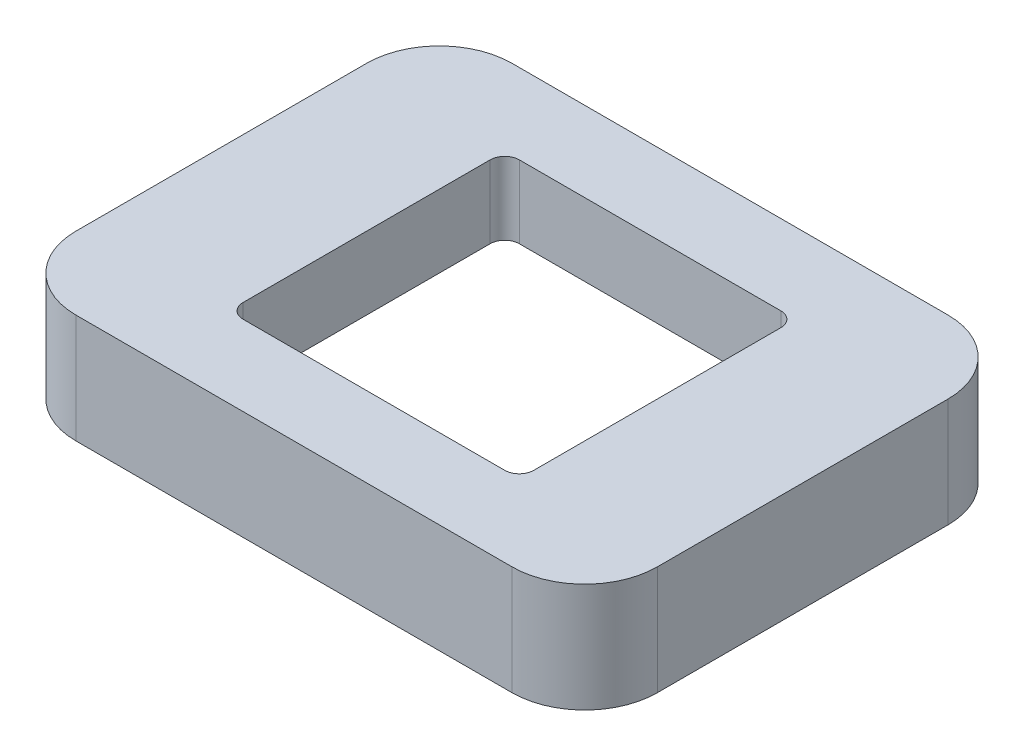
ISO-10303-21;
HEADER;
FILE_DESCRIPTION(('STEP AP214'),'2;1');
FILE_NAME('part.step','',(''),(''),'','','');
FILE_SCHEMA(('AUTOMOTIVE_DESIGN { 1 0 10303 214 1 1 1 1 }'));
ENDSEC;
DATA;
#1=APPLICATION_CONTEXT('core data for automotive mechanical design processes');
#2=APPLICATION_PROTOCOL_DEFINITION('international standard','automotive_design',2000,#1);
#3=PRODUCT_CONTEXT('',#1,'mechanical');
#4=PRODUCT('Part','Part','',(#3));
#5=PRODUCT_RELATED_PRODUCT_CATEGORY('part','',(#4));
#6=PRODUCT_DEFINITION_FORMATION('','',#4);
#7=PRODUCT_DEFINITION_CONTEXT('part definition',#1,'design');
#8=PRODUCT_DEFINITION('design','',#6,#7);
#9=PRODUCT_DEFINITION_SHAPE('','',#8);
#10=(LENGTH_UNIT() NAMED_UNIT(*) SI_UNIT(.MILLI.,.METRE.));
#11=(NAMED_UNIT(*) PLANE_ANGLE_UNIT() SI_UNIT($,.RADIAN.));
#12=(NAMED_UNIT(*) SI_UNIT($,.STERADIAN.) SOLID_ANGLE_UNIT());
#13=UNCERTAINTY_MEASURE_WITH_UNIT(LENGTH_MEASURE(1.E-05),#10,'distance_accuracy_value','');
#14=(GEOMETRIC_REPRESENTATION_CONTEXT(3) GLOBAL_UNCERTAINTY_ASSIGNED_CONTEXT((#13)) GLOBAL_UNIT_ASSIGNED_CONTEXT((#10,
#11,#12)) REPRESENTATION_CONTEXT('',''));
#15=CARTESIAN_POINT('',(0.,0.,0.));
#16=DIRECTION('',(0.,0.,1.));
#17=DIRECTION('',(1.,0.,0.));
#18=AXIS2_PLACEMENT_3D('',#15,#16,#17);
#19=CARTESIAN_POINT('',(10.,15.,50.));
#20=DIRECTION('',(0.,1.,0.));
#21=DIRECTION('',(0.,0.,1.));
#22=AXIS2_PLACEMENT_3D('',#19,#20,#21);
#23=PLANE('',#22);
#24=CARTESIAN_POINT('',(10.,15.,50.));
#25=DIRECTION('',(0.,1.,0.));
#26=DIRECTION('',(0.,0.,1.));
#27=AXIS2_PLACEMENT_3D('',#24,#25,#26);
#28=CIRCLE('',#27,10.);
#29=CARTESIAN_POINT('',(0.,15.,49.9999999999999));
#30=VERTEX_POINT('',#29);
#31=CARTESIAN_POINT('',(10.0000000000001,15.,60.));
#32=VERTEX_POINT('',#31);
#33=EDGE_CURVE('E326',#30,#32,#28,.T.);
#34=ORIENTED_EDGE('',*,*,#33,.T.);
#35=DIRECTION('',(1.,0.,0.));
#36=VECTOR('',#35,1.);
#37=CARTESIAN_POINT('',(10.0000000000001,15.,60.));
#38=LINE('',#37,#36);
#39=CARTESIAN_POINT('',(69.9999999999999,15.,60.));
#40=VERTEX_POINT('',#39);
#41=EDGE_CURVE('E329',#32,#40,#38,.T.);
#42=ORIENTED_EDGE('',*,*,#41,.T.);
#43=CARTESIAN_POINT('',(70.,15.,50.));
#44=DIRECTION('',(0.,1.,0.));
#45=DIRECTION('',(0.,0.,-1.));
#46=AXIS2_PLACEMENT_3D('',#43,#44,#45);
#47=CIRCLE('',#46,10.);
#48=CARTESIAN_POINT('',(80.,15.,49.9999999999999));
#49=VERTEX_POINT('',#48);
#50=EDGE_CURVE('E332',#40,#49,#47,.T.);
#51=ORIENTED_EDGE('',*,*,#50,.T.);
#52=DIRECTION('',(0.,0.,-1.));
#53=VECTOR('',#52,1.);
#54=CARTESIAN_POINT('',(80.,15.,10.0000000000001));
#55=LINE('',#54,#53);
#56=CARTESIAN_POINT('',(80.,15.,10.0000000000001));
#57=VERTEX_POINT('',#56);
#58=EDGE_CURVE('E334',#49,#57,#55,.T.);
#59=ORIENTED_EDGE('',*,*,#58,.T.);
#60=CARTESIAN_POINT('',(70.,15.,10.));
#61=DIRECTION('',(0.,1.,0.));
#62=DIRECTION('',(0.,0.,-1.));
#63=AXIS2_PLACEMENT_3D('',#60,#61,#62);
#64=CIRCLE('',#63,10.);
#65=CARTESIAN_POINT('',(69.9999999999999,15.,0.));
#66=VERTEX_POINT('',#65);
#67=EDGE_CURVE('E336',#57,#66,#64,.T.);
#68=ORIENTED_EDGE('',*,*,#67,.T.);
#69=DIRECTION('',(-1.,0.,0.));
#70=VECTOR('',#69,1.);
#71=CARTESIAN_POINT('',(10.0000000000001,15.,0.));
#72=LINE('',#71,#70);
#73=CARTESIAN_POINT('',(10.,15.,0.));
#74=VERTEX_POINT('',#73);
#75=EDGE_CURVE('E338',#66,#74,#72,.T.);
#76=ORIENTED_EDGE('',*,*,#75,.T.);
#77=CARTESIAN_POINT('',(10.,15.,10.));
#78=DIRECTION('',(0.,1.,0.));
#79=DIRECTION('',(0.,0.,-1.));
#80=AXIS2_PLACEMENT_3D('',#77,#78,#79);
#81=CIRCLE('',#80,10.);
#82=CARTESIAN_POINT('',(0.,15.,10.0000000000001));
#83=VERTEX_POINT('',#82);
#84=EDGE_CURVE('E340',#74,#83,#81,.T.);
#85=ORIENTED_EDGE('',*,*,#84,.T.);
#86=DIRECTION('',(0.,0.,1.));
#87=VECTOR('',#86,1.);
#88=CARTESIAN_POINT('',(0.,15.,10.0000000000001));
#89=LINE('',#88,#87);
#90=EDGE_CURVE('E342',#83,#30,#89,.T.);
#91=ORIENTED_EDGE('',*,*,#90,.T.);
#92=EDGE_LOOP('',(#34,#42,#51,#59,#68,#76,#85,#91));
#93=FACE_BOUND('',#92,.T.);
#94=DIRECTION('',(-1.,0.,0.));
#95=VECTOR('',#94,1.);
#96=CARTESIAN_POINT('',(58.,15.,11.));
#97=LINE('',#96,#95);
#98=CARTESIAN_POINT('',(58.,15.,11.));
#99=VERTEX_POINT('',#98);
#100=CARTESIAN_POINT('',(22.,15.,11.));
#101=VERTEX_POINT('',#100);
#102=EDGE_CURVE('E286',#99,#101,#97,.T.);
#103=ORIENTED_EDGE('',*,*,#102,.F.);
#104=CARTESIAN_POINT('',(58.,15.,13.));
#105=DIRECTION('',(0.,1.,0.));
#106=DIRECTION('',(0.,0.,1.));
#107=AXIS2_PLACEMENT_3D('',#104,#105,#106);
#108=CIRCLE('',#107,2.);
#109=CARTESIAN_POINT('',(60.,15.,13.));
#110=VERTEX_POINT('',#109);
#111=EDGE_CURVE('E284',#110,#99,#108,.T.);
#112=ORIENTED_EDGE('',*,*,#111,.F.);
#113=DIRECTION('',(0.,0.,-1.));
#114=VECTOR('',#113,1.);
#115=CARTESIAN_POINT('',(60.,15.,47.));
#116=LINE('',#115,#114);
#117=CARTESIAN_POINT('',(60.,15.,47.));
#118=VERTEX_POINT('',#117);
#119=EDGE_CURVE('E299',#118,#110,#116,.T.);
#120=ORIENTED_EDGE('',*,*,#119,.F.);
#121=CARTESIAN_POINT('',(58.,15.,47.));
#122=DIRECTION('',(0.,1.,0.));
#123=DIRECTION('',(0.,0.,-1.));
#124=AXIS2_PLACEMENT_3D('',#121,#122,#123);
#125=CIRCLE('',#124,2.);
#126=CARTESIAN_POINT('',(58.,15.,49.));
#127=VERTEX_POINT('',#126);
#128=EDGE_CURVE('E296',#127,#118,#125,.T.);
#129=ORIENTED_EDGE('',*,*,#128,.F.);
#130=DIRECTION('',(1.,0.,0.));
#131=VECTOR('',#130,1.);
#132=CARTESIAN_POINT('',(58.,15.,49.));
#133=LINE('',#132,#131);
#134=CARTESIAN_POINT('',(22.,15.,49.));
#135=VERTEX_POINT('',#134);
#136=EDGE_CURVE('E294',#135,#127,#133,.T.);
#137=ORIENTED_EDGE('',*,*,#136,.F.);
#138=CARTESIAN_POINT('',(22.,15.,47.));
#139=DIRECTION('',(0.,1.,0.));
#140=DIRECTION('',(0.,0.,1.));
#141=AXIS2_PLACEMENT_3D('',#138,#139,#140);
#142=CIRCLE('',#141,2.);
#143=CARTESIAN_POINT('',(20.,15.,47.));
#144=VERTEX_POINT('',#143);
#145=EDGE_CURVE('E292',#144,#135,#142,.T.);
#146=ORIENTED_EDGE('',*,*,#145,.F.);
#147=DIRECTION('',(0.,0.,1.));
#148=VECTOR('',#147,1.);
#149=CARTESIAN_POINT('',(20.,15.,47.));
#150=LINE('',#149,#148);
#151=CARTESIAN_POINT('',(20.,15.,13.));
#152=VERTEX_POINT('',#151);
#153=EDGE_CURVE('E290',#152,#144,#150,.T.);
#154=ORIENTED_EDGE('',*,*,#153,.F.);
#155=CARTESIAN_POINT('',(22.,15.,13.));
#156=DIRECTION('',(0.,1.,0.));
#157=DIRECTION('',(0.,0.,1.));
#158=AXIS2_PLACEMENT_3D('',#155,#156,#157);
#159=CIRCLE('',#158,2.);
#160=EDGE_CURVE('E288',#101,#152,#159,.T.);
#161=ORIENTED_EDGE('',*,*,#160,.F.);
#162=EDGE_LOOP('',(#103,#112,#120,#129,#137,#146,#154,#161));
#163=FACE_BOUND('',#162,.T.);
#164=ADVANCED_FACE('F37',(#93,#163),#23,.T.);
#165=CARTESIAN_POINT('',(10.,0.,50.));
#166=DIRECTION('',(0.,1.,0.));
#167=DIRECTION('',(0.,0.,1.));
#168=AXIS2_PLACEMENT_3D('',#165,#166,#167);
#169=PLANE('',#168);
#170=DIRECTION('',(0.,0.,-1.));
#171=VECTOR('',#170,1.);
#172=CARTESIAN_POINT('',(3.,0.,52.));
#173=LINE('',#172,#171);
#174=CARTESIAN_POINT('',(3.,0.,52.));
#175=VERTEX_POINT('',#174);
#176=CARTESIAN_POINT('',(3.00000000000001,0.,8.));
#177=VERTEX_POINT('',#176);
#178=EDGE_CURVE('E241',#175,#177,#173,.T.);
#179=ORIENTED_EDGE('',*,*,#178,.F.);
#180=CARTESIAN_POINT('',(8.,0.,52.));
#181=DIRECTION('',(0.,-1.,0.));
#182=DIRECTION('',(0.,0.,1.));
#183=AXIS2_PLACEMENT_3D('',#180,#181,#182);
#184=CIRCLE('',#183,5.);
#185=CARTESIAN_POINT('',(8.,0.,57.));
#186=VERTEX_POINT('',#185);
#187=EDGE_CURVE('E52',#186,#175,#184,.T.);
#188=ORIENTED_EDGE('',*,*,#187,.F.);
#189=DIRECTION('',(-1.,0.,0.));
#190=VECTOR('',#189,1.);
#191=CARTESIAN_POINT('',(8.,0.,57.));
#192=LINE('',#191,#190);
#193=CARTESIAN_POINT('',(72.,0.,57.));
#194=VERTEX_POINT('',#193);
#195=EDGE_CURVE('E218',#194,#186,#192,.T.);
#196=ORIENTED_EDGE('',*,*,#195,.F.);
#197=CARTESIAN_POINT('',(72.,0.,52.));
#198=DIRECTION('',(0.,-1.,0.));
#199=DIRECTION('',(0.,0.,-1.));
#200=AXIS2_PLACEMENT_3D('',#197,#198,#199);
#201=CIRCLE('',#200,5.);
#202=CARTESIAN_POINT('',(77.,0.,52.));
#203=VERTEX_POINT('',#202);
#204=EDGE_CURVE('E221',#203,#194,#201,.T.);
#205=ORIENTED_EDGE('',*,*,#204,.F.);
#206=DIRECTION('',(0.,0.,1.));
#207=VECTOR('',#206,1.);
#208=CARTESIAN_POINT('',(77.,0.,52.));
#209=LINE('',#208,#207);
#210=CARTESIAN_POINT('',(77.,0.,8.));
#211=VERTEX_POINT('',#210);
#212=EDGE_CURVE('E253',#211,#203,#209,.T.);
#213=ORIENTED_EDGE('',*,*,#212,.F.);
#214=CARTESIAN_POINT('',(72.,0.,8.));
#215=DIRECTION('',(0.,-1.,0.));
#216=DIRECTION('',(0.,0.,-1.));
#217=AXIS2_PLACEMENT_3D('',#214,#215,#216);
#218=CIRCLE('',#217,5.00000000000001);
#219=CARTESIAN_POINT('',(72.,0.,3.));
#220=VERTEX_POINT('',#219);
#221=EDGE_CURVE('E250',#220,#211,#218,.T.);
#222=ORIENTED_EDGE('',*,*,#221,.F.);
#223=DIRECTION('',(1.,0.,0.));
#224=VECTOR('',#223,1.);
#225=CARTESIAN_POINT('',(8.00000000000001,0.,3.));
#226=LINE('',#225,#224);
#227=CARTESIAN_POINT('',(8.00000000000001,0.,3.));
#228=VERTEX_POINT('',#227);
#229=EDGE_CURVE('E247',#228,#220,#226,.T.);
#230=ORIENTED_EDGE('',*,*,#229,.F.);
#231=CARTESIAN_POINT('',(8.00000000000001,0.,8.));
#232=DIRECTION('',(0.,-1.,0.));
#233=DIRECTION('',(0.,0.,-1.));
#234=AXIS2_PLACEMENT_3D('',#231,#232,#233);
#235=CIRCLE('',#234,5.);
#236=EDGE_CURVE('E244',#177,#228,#235,.T.);
#237=ORIENTED_EDGE('',*,*,#236,.F.);
#238=EDGE_LOOP('',(#179,#188,#196,#205,#213,#222,#230,#237));
#239=FACE_BOUND('',#238,.T.);
#240=CARTESIAN_POINT('',(10.,0.,50.));
#241=DIRECTION('',(0.,1.,0.));
#242=DIRECTION('',(0.,0.,1.));
#243=AXIS2_PLACEMENT_3D('',#240,#241,#242);
#244=CIRCLE('',#243,10.);
#245=CARTESIAN_POINT('',(0.,0.,49.9999999999999));
#246=VERTEX_POINT('',#245);
#247=CARTESIAN_POINT('',(10.0000000000001,0.,60.));
#248=VERTEX_POINT('',#247);
#249=EDGE_CURVE('E325',#246,#248,#244,.T.);
#250=ORIENTED_EDGE('',*,*,#249,.F.);
#251=DIRECTION('',(0.,0.,1.));
#252=VECTOR('',#251,1.);
#253=CARTESIAN_POINT('',(0.,0.,10.0000000000001));
#254=LINE('',#253,#252);
#255=CARTESIAN_POINT('',(0.,0.,10.0000000000001));
#256=VERTEX_POINT('',#255);
#257=EDGE_CURVE('E330',#256,#246,#254,.T.);
#258=ORIENTED_EDGE('',*,*,#257,.F.);
#259=CARTESIAN_POINT('',(10.,0.,10.));
#260=DIRECTION('',(0.,1.,0.));
#261=DIRECTION('',(0.,0.,-1.));
#262=AXIS2_PLACEMENT_3D('',#259,#260,#261);
#263=CIRCLE('',#262,10.);
#264=CARTESIAN_POINT('',(10.,0.,0.));
#265=VERTEX_POINT('',#264);
#266=EDGE_CURVE('E357',#265,#256,#263,.T.);
#267=ORIENTED_EDGE('',*,*,#266,.F.);
#268=DIRECTION('',(-1.,0.,0.));
#269=VECTOR('',#268,1.);
#270=CARTESIAN_POINT('',(10.0000000000001,0.,0.));
#271=LINE('',#270,#269);
#272=CARTESIAN_POINT('',(69.9999999999999,0.,0.));
#273=VERTEX_POINT('',#272);
#274=EDGE_CURVE('E355',#273,#265,#271,.T.);
#275=ORIENTED_EDGE('',*,*,#274,.F.);
#276=CARTESIAN_POINT('',(70.,0.,10.));
#277=DIRECTION('',(0.,1.,0.));
#278=DIRECTION('',(0.,0.,-1.));
#279=AXIS2_PLACEMENT_3D('',#276,#277,#278);
#280=CIRCLE('',#279,10.);
#281=CARTESIAN_POINT('',(80.,0.,10.0000000000001));
#282=VERTEX_POINT('',#281);
#283=EDGE_CURVE('E353',#282,#273,#280,.T.);
#284=ORIENTED_EDGE('',*,*,#283,.F.);
#285=DIRECTION('',(0.,0.,-1.));
#286=VECTOR('',#285,1.);
#287=CARTESIAN_POINT('',(80.,0.,10.0000000000001));
#288=LINE('',#287,#286);
#289=CARTESIAN_POINT('',(80.,0.,49.9999999999999));
#290=VERTEX_POINT('',#289);
#291=EDGE_CURVE('E351',#290,#282,#288,.T.);
#292=ORIENTED_EDGE('',*,*,#291,.F.);
#293=CARTESIAN_POINT('',(70.,0.,50.));
#294=DIRECTION('',(0.,1.,0.));
#295=DIRECTION('',(0.,0.,-1.));
#296=AXIS2_PLACEMENT_3D('',#293,#294,#295);
#297=CIRCLE('',#296,10.);
#298=CARTESIAN_POINT('',(69.9999999999999,0.,60.));
#299=VERTEX_POINT('',#298);
#300=EDGE_CURVE('E349',#299,#290,#297,.T.);
#301=ORIENTED_EDGE('',*,*,#300,.F.);
#302=DIRECTION('',(1.,0.,0.));
#303=VECTOR('',#302,1.);
#304=CARTESIAN_POINT('',(10.0000000000001,0.,60.));
#305=LINE('',#304,#303);
#306=EDGE_CURVE('E347',#248,#299,#305,.T.);
#307=ORIENTED_EDGE('',*,*,#306,.F.);
#308=EDGE_LOOP('',(#250,#258,#267,#275,#284,#292,#301,#307));
#309=FACE_BOUND('',#308,.T.);
#310=ADVANCED_FACE('F390',(#239,#309),#169,.F.);
#311=CARTESIAN_POINT('',(10.,15.,50.));
#312=DIRECTION('',(0.,-1.,0.));
#313=DIRECTION('',(0.,0.,-1.));
#314=AXIS2_PLACEMENT_3D('',#311,#312,#313);
#315=CYLINDRICAL_SURFACE('',#314,10.);
#316=ORIENTED_EDGE('',*,*,#249,.T.);
#317=DIRECTION('',(0.,-1.,0.));
#318=VECTOR('',#317,1.);
#319=CARTESIAN_POINT('',(10.0000000000001,15.,60.));
#320=LINE('',#319,#318);
#321=EDGE_CURVE('E45',#32,#248,#320,.T.);
#322=ORIENTED_EDGE('',*,*,#321,.F.);
#323=ORIENTED_EDGE('',*,*,#33,.F.);
#324=DIRECTION('',(0.,-1.,0.));
#325=VECTOR('',#324,1.);
#326=CARTESIAN_POINT('',(0.,15.,49.9999999999999));
#327=LINE('',#326,#325);
#328=EDGE_CURVE('E344',#30,#246,#327,.T.);
#329=ORIENTED_EDGE('',*,*,#328,.T.);
#330=EDGE_LOOP('',(#316,#322,#323,#329));
#331=FACE_BOUND('',#330,.T.);
#332=ADVANCED_FACE('F39',(#331),#315,.T.);
#333=CARTESIAN_POINT('',(10.0000000000001,15.,60.));
#334=DIRECTION('',(0.,0.,-1.));
#335=DIRECTION('',(-1.,0.,0.));
#336=AXIS2_PLACEMENT_3D('',#333,#334,#335);
#337=PLANE('',#336);
#338=ORIENTED_EDGE('',*,*,#306,.T.);
#339=DIRECTION('',(0.,-1.,0.));
#340=VECTOR('',#339,1.);
#341=CARTESIAN_POINT('',(69.9999999999999,15.,60.));
#342=LINE('',#341,#340);
#343=EDGE_CURVE('E377',#40,#299,#342,.T.);
#344=ORIENTED_EDGE('',*,*,#343,.F.);
#345=ORIENTED_EDGE('',*,*,#41,.F.);
#346=ORIENTED_EDGE('',*,*,#321,.T.);
#347=EDGE_LOOP('',(#338,#344,#345,#346));
#348=FACE_BOUND('',#347,.T.);
#349=ADVANCED_FACE('F382',(#348),#337,.F.);
#350=CARTESIAN_POINT('',(70.,15.,50.));
#351=DIRECTION('',(0.,-1.,0.));
#352=DIRECTION('',(0.,0.,-1.));
#353=AXIS2_PLACEMENT_3D('',#350,#351,#352);
#354=CYLINDRICAL_SURFACE('',#353,10.);
#355=ORIENTED_EDGE('',*,*,#300,.T.);
#356=DIRECTION('',(0.,-1.,0.));
#357=VECTOR('',#356,1.);
#358=CARTESIAN_POINT('',(80.,15.,49.9999999999999));
#359=LINE('',#358,#357);
#360=EDGE_CURVE('E374',#49,#290,#359,.T.);
#361=ORIENTED_EDGE('',*,*,#360,.F.);
#362=ORIENTED_EDGE('',*,*,#50,.F.);
#363=ORIENTED_EDGE('',*,*,#343,.T.);
#364=EDGE_LOOP('',(#355,#361,#362,#363));
#365=FACE_BOUND('',#364,.T.);
#366=ADVANCED_FACE('F397',(#365),#354,.T.);
#367=CARTESIAN_POINT('',(80.,15.,10.0000000000001));
#368=DIRECTION('',(-1.,0.,0.));
#369=DIRECTION('',(0.,0.,1.));
#370=AXIS2_PLACEMENT_3D('',#367,#368,#369);
#371=PLANE('',#370);
#372=ORIENTED_EDGE('',*,*,#291,.T.);
#373=DIRECTION('',(0.,-1.,0.));
#374=VECTOR('',#373,1.);
#375=CARTESIAN_POINT('',(80.,15.,10.0000000000001));
#376=LINE('',#375,#374);
#377=EDGE_CURVE('E371',#57,#282,#376,.T.);
#378=ORIENTED_EDGE('',*,*,#377,.F.);
#379=ORIENTED_EDGE('',*,*,#58,.F.);
#380=ORIENTED_EDGE('',*,*,#360,.T.);
#381=EDGE_LOOP('',(#372,#378,#379,#380));
#382=FACE_BOUND('',#381,.T.);
#383=ADVANCED_FACE('F401',(#382),#371,.F.);
#384=CARTESIAN_POINT('',(70.,15.,10.));
#385=DIRECTION('',(0.,-1.,0.));
#386=DIRECTION('',(0.,0.,-1.));
#387=AXIS2_PLACEMENT_3D('',#384,#385,#386);
#388=CYLINDRICAL_SURFACE('',#387,10.);
#389=ORIENTED_EDGE('',*,*,#283,.T.);
#390=DIRECTION('',(0.,-1.,0.));
#391=VECTOR('',#390,1.);
#392=CARTESIAN_POINT('',(69.9999999999999,15.,0.));
#393=LINE('',#392,#391);
#394=EDGE_CURVE('E368',#66,#273,#393,.T.);
#395=ORIENTED_EDGE('',*,*,#394,.F.);
#396=ORIENTED_EDGE('',*,*,#67,.F.);
#397=ORIENTED_EDGE('',*,*,#377,.T.);
#398=EDGE_LOOP('',(#389,#395,#396,#397));
#399=FACE_BOUND('',#398,.T.);
#400=ADVANCED_FACE('F420',(#399),#388,.T.);
#401=CARTESIAN_POINT('',(10.0000000000001,15.,0.));
#402=DIRECTION('',(0.,0.,1.));
#403=DIRECTION('',(1.,0.,0.));
#404=AXIS2_PLACEMENT_3D('',#401,#402,#403);
#405=PLANE('',#404);
#406=ORIENTED_EDGE('',*,*,#274,.T.);
#407=DIRECTION('',(0.,-1.,0.));
#408=VECTOR('',#407,1.);
#409=CARTESIAN_POINT('',(10.,15.,0.));
#410=LINE('',#409,#408);
#411=EDGE_CURVE('E365',#74,#265,#410,.T.);
#412=ORIENTED_EDGE('',*,*,#411,.F.);
#413=ORIENTED_EDGE('',*,*,#75,.F.);
#414=ORIENTED_EDGE('',*,*,#394,.T.);
#415=EDGE_LOOP('',(#406,#412,#413,#414));
#416=FACE_BOUND('',#415,.T.);
#417=ADVANCED_FACE('F417',(#416),#405,.F.);
#418=CARTESIAN_POINT('',(10.,15.,10.));
#419=DIRECTION('',(0.,-1.,0.));
#420=DIRECTION('',(0.,0.,-1.));
#421=AXIS2_PLACEMENT_3D('',#418,#419,#420);
#422=CYLINDRICAL_SURFACE('',#421,10.);
#423=ORIENTED_EDGE('',*,*,#266,.T.);
#424=DIRECTION('',(0.,-1.,0.));
#425=VECTOR('',#424,1.);
#426=CARTESIAN_POINT('',(0.,15.,10.0000000000001));
#427=LINE('',#426,#425);
#428=EDGE_CURVE('E362',#83,#256,#427,.T.);
#429=ORIENTED_EDGE('',*,*,#428,.F.);
#430=ORIENTED_EDGE('',*,*,#84,.F.);
#431=ORIENTED_EDGE('',*,*,#411,.T.);
#432=EDGE_LOOP('',(#423,#429,#430,#431));
#433=FACE_BOUND('',#432,.T.);
#434=ADVANCED_FACE('F413',(#433),#422,.T.);
#435=CARTESIAN_POINT('',(0.,15.,10.0000000000001));
#436=DIRECTION('',(1.,0.,0.));
#437=DIRECTION('',(0.,0.,-1.));
#438=AXIS2_PLACEMENT_3D('',#435,#436,#437);
#439=PLANE('',#438);
#440=ORIENTED_EDGE('',*,*,#257,.T.);
#441=ORIENTED_EDGE('',*,*,#328,.F.);
#442=ORIENTED_EDGE('',*,*,#90,.F.);
#443=ORIENTED_EDGE('',*,*,#428,.T.);
#444=EDGE_LOOP('',(#440,#441,#442,#443));
#445=FACE_BOUND('',#444,.T.);
#446=ADVANCED_FACE('F411',(#445),#439,.F.);
#447=CARTESIAN_POINT('',(58.,15.,13.));
#448=DIRECTION('',(0.,-1.,0.));
#449=DIRECTION('',(0.,0.,-1.));
#450=AXIS2_PLACEMENT_3D('',#447,#448,#449);
#451=CYLINDRICAL_SURFACE('',#450,2.);
#452=CARTESIAN_POINT('',(58.,5.,13.));
#453=DIRECTION('',(0.,1.,0.));
#454=DIRECTION('',(0.,0.,1.));
#455=AXIS2_PLACEMENT_3D('',#452,#453,#454);
#456=CIRCLE('',#455,2.);
#457=CARTESIAN_POINT('',(60.,5.,13.));
#458=VERTEX_POINT('',#457);
#459=CARTESIAN_POINT('',(58.,5.,11.));
#460=VERTEX_POINT('',#459);
#461=EDGE_CURVE('E282',#458,#460,#456,.T.);
#462=ORIENTED_EDGE('',*,*,#461,.F.);
#463=DIRECTION('',(0.,-1.,0.));
#464=VECTOR('',#463,1.);
#465=CARTESIAN_POINT('',(60.,15.,13.));
#466=LINE('',#465,#464);
#467=EDGE_CURVE('E301',#110,#458,#466,.T.);
#468=ORIENTED_EDGE('',*,*,#467,.F.);
#469=ORIENTED_EDGE('',*,*,#111,.T.);
#470=DIRECTION('',(0.,-1.,0.));
#471=VECTOR('',#470,1.);
#472=CARTESIAN_POINT('',(58.,15.,11.));
#473=LINE('',#472,#471);
#474=EDGE_CURVE('E322',#99,#460,#473,.T.);
#475=ORIENTED_EDGE('',*,*,#474,.T.);
#476=EDGE_LOOP('',(#462,#468,#469,#475));
#477=FACE_BOUND('',#476,.T.);
#478=ADVANCED_FACE('F437',(#477),#451,.F.);
#479=CARTESIAN_POINT('',(58.,15.,11.));
#480=DIRECTION('',(0.,0.,1.));
#481=DIRECTION('',(1.,0.,0.));
#482=AXIS2_PLACEMENT_3D('',#479,#480,#481);
#483=PLANE('',#482);
#484=DIRECTION('',(-1.,0.,0.));
#485=VECTOR('',#484,1.);
#486=CARTESIAN_POINT('',(58.,5.,11.));
#487=LINE('',#486,#485);
#488=CARTESIAN_POINT('',(22.,5.,11.));
#489=VERTEX_POINT('',#488);
#490=EDGE_CURVE('E280',#460,#489,#487,.T.);
#491=ORIENTED_EDGE('',*,*,#490,.F.);
#492=ORIENTED_EDGE('',*,*,#474,.F.);
#493=ORIENTED_EDGE('',*,*,#102,.T.);
#494=DIRECTION('',(0.,-1.,0.));
#495=VECTOR('',#494,1.);
#496=CARTESIAN_POINT('',(22.,15.,11.));
#497=LINE('',#496,#495);
#498=EDGE_CURVE('E319',#101,#489,#497,.T.);
#499=ORIENTED_EDGE('',*,*,#498,.T.);
#500=EDGE_LOOP('',(#491,#492,#493,#499));
#501=FACE_BOUND('',#500,.T.);
#502=ADVANCED_FACE('F458',(#501),#483,.T.);
#503=CARTESIAN_POINT('',(22.,15.,13.));
#504=DIRECTION('',(0.,-1.,0.));
#505=DIRECTION('',(0.,0.,-1.));
#506=AXIS2_PLACEMENT_3D('',#503,#504,#505);
#507=CYLINDRICAL_SURFACE('',#506,2.);
#508=CARTESIAN_POINT('',(22.,5.,13.));
#509=DIRECTION('',(0.,1.,0.));
#510=DIRECTION('',(0.,0.,1.));
#511=AXIS2_PLACEMENT_3D('',#508,#509,#510);
#512=CIRCLE('',#511,2.);
#513=CARTESIAN_POINT('',(20.,5.,13.));
#514=VERTEX_POINT('',#513);
#515=EDGE_CURVE('E278',#489,#514,#512,.T.);
#516=ORIENTED_EDGE('',*,*,#515,.F.);
#517=ORIENTED_EDGE('',*,*,#498,.F.);
#518=ORIENTED_EDGE('',*,*,#160,.T.);
#519=DIRECTION('',(0.,-1.,0.));
#520=VECTOR('',#519,1.);
#521=CARTESIAN_POINT('',(20.,15.,13.));
#522=LINE('',#521,#520);
#523=EDGE_CURVE('E316',#152,#514,#522,.T.);
#524=ORIENTED_EDGE('',*,*,#523,.T.);
#525=EDGE_LOOP('',(#516,#517,#518,#524));
#526=FACE_BOUND('',#525,.T.);
#527=ADVANCED_FACE('F465',(#526),#507,.F.);
#528=CARTESIAN_POINT('',(20.,15.,47.));
#529=DIRECTION('',(1.,0.,0.));
#530=DIRECTION('',(0.,0.,-1.));
#531=AXIS2_PLACEMENT_3D('',#528,#529,#530);
#532=PLANE('',#531);
#533=DIRECTION('',(0.,0.,1.));
#534=VECTOR('',#533,1.);
#535=CARTESIAN_POINT('',(20.,5.,47.));
#536=LINE('',#535,#534);
#537=CARTESIAN_POINT('',(20.,5.,47.));
#538=VERTEX_POINT('',#537);
#539=EDGE_CURVE('E276',#514,#538,#536,.T.);
#540=ORIENTED_EDGE('',*,*,#539,.F.);
#541=ORIENTED_EDGE('',*,*,#523,.F.);
#542=ORIENTED_EDGE('',*,*,#153,.T.);
#543=DIRECTION('',(0.,-1.,0.));
#544=VECTOR('',#543,1.);
#545=CARTESIAN_POINT('',(20.,15.,47.));
#546=LINE('',#545,#544);
#547=EDGE_CURVE('E313',#144,#538,#546,.T.);
#548=ORIENTED_EDGE('',*,*,#547,.T.);
#549=EDGE_LOOP('',(#540,#541,#542,#548));
#550=FACE_BOUND('',#549,.T.);
#551=ADVANCED_FACE('F472',(#550),#532,.T.);
#552=CARTESIAN_POINT('',(22.,15.,47.));
#553=DIRECTION('',(0.,-1.,0.));
#554=DIRECTION('',(0.,0.,-1.));
#555=AXIS2_PLACEMENT_3D('',#552,#553,#554);
#556=CYLINDRICAL_SURFACE('',#555,2.);
#557=CARTESIAN_POINT('',(22.,5.,47.));
#558=DIRECTION('',(0.,1.,0.));
#559=DIRECTION('',(0.,0.,1.));
#560=AXIS2_PLACEMENT_3D('',#557,#558,#559);
#561=CIRCLE('',#560,2.);
#562=CARTESIAN_POINT('',(22.,5.,49.));
#563=VERTEX_POINT('',#562);
#564=EDGE_CURVE('E274',#538,#563,#561,.T.);
#565=ORIENTED_EDGE('',*,*,#564,.F.);
#566=ORIENTED_EDGE('',*,*,#547,.F.);
#567=ORIENTED_EDGE('',*,*,#145,.T.);
#568=DIRECTION('',(0.,-1.,0.));
#569=VECTOR('',#568,1.);
#570=CARTESIAN_POINT('',(22.,15.,49.));
#571=LINE('',#570,#569);
#572=EDGE_CURVE('E310',#135,#563,#571,.T.);
#573=ORIENTED_EDGE('',*,*,#572,.T.);
#574=EDGE_LOOP('',(#565,#566,#567,#573));
#575=FACE_BOUND('',#574,.T.);
#576=ADVANCED_FACE('F480',(#575),#556,.F.);
#577=CARTESIAN_POINT('',(58.,15.,49.));
#578=DIRECTION('',(0.,0.,-1.));
#579=DIRECTION('',(-1.,0.,0.));
#580=AXIS2_PLACEMENT_3D('',#577,#578,#579);
#581=PLANE('',#580);
#582=DIRECTION('',(1.,0.,0.));
#583=VECTOR('',#582,1.);
#584=CARTESIAN_POINT('',(58.,5.,49.));
#585=LINE('',#584,#583);
#586=CARTESIAN_POINT('',(58.,5.,49.));
#587=VERTEX_POINT('',#586);
#588=EDGE_CURVE('E272',#563,#587,#585,.T.);
#589=ORIENTED_EDGE('',*,*,#588,.F.);
#590=ORIENTED_EDGE('',*,*,#572,.F.);
#591=ORIENTED_EDGE('',*,*,#136,.T.);
#592=DIRECTION('',(0.,-1.,0.));
#593=VECTOR('',#592,1.);
#594=CARTESIAN_POINT('',(58.,15.,49.));
#595=LINE('',#594,#593);
#596=EDGE_CURVE('E307',#127,#587,#595,.T.);
#597=ORIENTED_EDGE('',*,*,#596,.T.);
#598=EDGE_LOOP('',(#589,#590,#591,#597));
#599=FACE_BOUND('',#598,.T.);
#600=ADVANCED_FACE('F488',(#599),#581,.T.);
#601=CARTESIAN_POINT('',(58.,15.,47.));
#602=DIRECTION('',(0.,-1.,0.));
#603=DIRECTION('',(0.,0.,-1.));
#604=AXIS2_PLACEMENT_3D('',#601,#602,#603);
#605=CYLINDRICAL_SURFACE('',#604,2.);
#606=CARTESIAN_POINT('',(58.,5.,47.));
#607=DIRECTION('',(0.,1.,0.));
#608=DIRECTION('',(0.,0.,1.));
#609=AXIS2_PLACEMENT_3D('',#606,#607,#608);
#610=CIRCLE('',#609,2.);
#611=CARTESIAN_POINT('',(60.,5.,47.));
#612=VERTEX_POINT('',#611);
#613=EDGE_CURVE('E59',#587,#612,#610,.T.);
#614=ORIENTED_EDGE('',*,*,#613,.F.);
#615=ORIENTED_EDGE('',*,*,#596,.F.);
#616=ORIENTED_EDGE('',*,*,#128,.T.);
#617=DIRECTION('',(0.,-1.,0.));
#618=VECTOR('',#617,1.);
#619=CARTESIAN_POINT('',(60.,15.,47.));
#620=LINE('',#619,#618);
#621=EDGE_CURVE('E304',#118,#612,#620,.T.);
#622=ORIENTED_EDGE('',*,*,#621,.T.);
#623=EDGE_LOOP('',(#614,#615,#616,#622));
#624=FACE_BOUND('',#623,.T.);
#625=ADVANCED_FACE('F496',(#624),#605,.F.);
#626=CARTESIAN_POINT('',(60.,15.,47.));
#627=DIRECTION('',(-1.,0.,0.));
#628=DIRECTION('',(0.,0.,1.));
#629=AXIS2_PLACEMENT_3D('',#626,#627,#628);
#630=PLANE('',#629);
#631=DIRECTION('',(0.,0.,-1.));
#632=VECTOR('',#631,1.);
#633=CARTESIAN_POINT('',(60.,5.,47.));
#634=LINE('',#633,#632);
#635=EDGE_CURVE('E11',#612,#458,#634,.T.);
#636=ORIENTED_EDGE('',*,*,#635,.F.);
#637=ORIENTED_EDGE('',*,*,#621,.F.);
#638=ORIENTED_EDGE('',*,*,#119,.T.);
#639=ORIENTED_EDGE('',*,*,#467,.T.);
#640=EDGE_LOOP('',(#636,#637,#638,#639));
#641=FACE_BOUND('',#640,.T.);
#642=ADVANCED_FACE('F504',(#641),#630,.T.);
#643=CARTESIAN_POINT('',(8.,5.,52.));
#644=DIRECTION('',(0.,-1.,0.));
#645=DIRECTION('',(0.,0.,-1.));
#646=AXIS2_PLACEMENT_3D('',#643,#644,#645);
#647=CYLINDRICAL_SURFACE('',#646,5.);
#648=ORIENTED_EDGE('',*,*,#187,.T.);
#649=DIRECTION('',(0.,-1.,0.));
#650=VECTOR('',#649,1.);
#651=CARTESIAN_POINT('',(3.,5.,52.));
#652=LINE('',#651,#650);
#653=CARTESIAN_POINT('',(3.,5.,52.));
#654=VERTEX_POINT('',#653);
#655=EDGE_CURVE('E195',#654,#175,#652,.T.);
#656=ORIENTED_EDGE('',*,*,#655,.F.);
#657=CARTESIAN_POINT('',(8.,5.,52.));
#658=DIRECTION('',(0.,-1.,0.));
#659=DIRECTION('',(0.,0.,1.));
#660=AXIS2_PLACEMENT_3D('',#657,#658,#659);
#661=CIRCLE('',#660,5.);
#662=CARTESIAN_POINT('',(8.,5.,57.));
#663=VERTEX_POINT('',#662);
#664=EDGE_CURVE('E199',#663,#654,#661,.T.);
#665=ORIENTED_EDGE('',*,*,#664,.F.);
#666=DIRECTION('',(0.,-1.,0.));
#667=VECTOR('',#666,1.);
#668=CARTESIAN_POINT('',(8.,5.,57.));
#669=LINE('',#668,#667);
#670=EDGE_CURVE('E258',#663,#186,#669,.T.);
#671=ORIENTED_EDGE('',*,*,#670,.T.);
#672=EDGE_LOOP('',(#648,#656,#665,#671));
#673=FACE_BOUND('',#672,.T.);
#674=ADVANCED_FACE('F197',(#673),#647,.F.);
#675=CARTESIAN_POINT('',(8.,5.,57.));
#676=DIRECTION('',(0.,0.,1.));
#677=DIRECTION('',(1.,0.,0.));
#678=AXIS2_PLACEMENT_3D('',#675,#676,#677);
#679=PLANE('',#678);
#680=ORIENTED_EDGE('',*,*,#195,.T.);
#681=ORIENTED_EDGE('',*,*,#670,.F.);
#682=DIRECTION('',(-1.,0.,0.));
#683=VECTOR('',#682,1.);
#684=CARTESIAN_POINT('',(8.,5.,57.));
#685=LINE('',#684,#683);
#686=CARTESIAN_POINT('',(72.,5.,57.));
#687=VERTEX_POINT('',#686);
#688=EDGE_CURVE('E205',#687,#663,#685,.T.);
#689=ORIENTED_EDGE('',*,*,#688,.F.);
#690=DIRECTION('',(0.,-1.,0.));
#691=VECTOR('',#690,1.);
#692=CARTESIAN_POINT('',(72.,5.,57.));
#693=LINE('',#692,#691);
#694=EDGE_CURVE('E260',#687,#194,#693,.T.);
#695=ORIENTED_EDGE('',*,*,#694,.T.);
#696=EDGE_LOOP('',(#680,#681,#689,#695));
#697=FACE_BOUND('',#696,.T.);
#698=ADVANCED_FACE('F519',(#697),#679,.F.);
#699=CARTESIAN_POINT('',(72.,5.,52.));
#700=DIRECTION('',(0.,-1.,0.));
#701=DIRECTION('',(0.,0.,-1.));
#702=AXIS2_PLACEMENT_3D('',#699,#700,#701);
#703=CYLINDRICAL_SURFACE('',#702,5.);
#704=ORIENTED_EDGE('',*,*,#204,.T.);
#705=ORIENTED_EDGE('',*,*,#694,.F.);
#706=CARTESIAN_POINT('',(72.,5.,52.));
#707=DIRECTION('',(0.,-1.,0.));
#708=DIRECTION('',(0.,0.,-1.));
#709=AXIS2_PLACEMENT_3D('',#706,#707,#708);
#710=CIRCLE('',#709,5.);
#711=CARTESIAN_POINT('',(77.,5.,52.));
#712=VERTEX_POINT('',#711);
#713=EDGE_CURVE('E237',#712,#687,#710,.T.);
#714=ORIENTED_EDGE('',*,*,#713,.F.);
#715=DIRECTION('',(0.,-1.,0.));
#716=VECTOR('',#715,1.);
#717=CARTESIAN_POINT('',(77.,5.,52.));
#718=LINE('',#717,#716);
#719=EDGE_CURVE('E262',#712,#203,#718,.T.);
#720=ORIENTED_EDGE('',*,*,#719,.T.);
#721=EDGE_LOOP('',(#704,#705,#714,#720));
#722=FACE_BOUND('',#721,.T.);
#723=ADVANCED_FACE('F526',(#722),#703,.F.);
#724=CARTESIAN_POINT('',(77.,5.,52.));
#725=DIRECTION('',(1.,0.,0.));
#726=DIRECTION('',(0.,0.,-1.));
#727=AXIS2_PLACEMENT_3D('',#724,#725,#726);
#728=PLANE('',#727);
#729=ORIENTED_EDGE('',*,*,#212,.T.);
#730=ORIENTED_EDGE('',*,*,#719,.F.);
#731=DIRECTION('',(0.,0.,1.));
#732=VECTOR('',#731,1.);
#733=CARTESIAN_POINT('',(77.,5.,52.));
#734=LINE('',#733,#732);
#735=CARTESIAN_POINT('',(77.,5.,8.));
#736=VERTEX_POINT('',#735);
#737=EDGE_CURVE('E234',#736,#712,#734,.T.);
#738=ORIENTED_EDGE('',*,*,#737,.F.);
#739=DIRECTION('',(0.,-1.,0.));
#740=VECTOR('',#739,1.);
#741=CARTESIAN_POINT('',(77.,5.,8.));
#742=LINE('',#741,#740);
#743=EDGE_CURVE('E264',#736,#211,#742,.T.);
#744=ORIENTED_EDGE('',*,*,#743,.T.);
#745=EDGE_LOOP('',(#729,#730,#738,#744));
#746=FACE_BOUND('',#745,.T.);
#747=ADVANCED_FACE('F534',(#746),#728,.F.);
#748=CARTESIAN_POINT('',(72.,5.,8.));
#749=DIRECTION('',(0.,-1.,0.));
#750=DIRECTION('',(0.,0.,-1.));
#751=AXIS2_PLACEMENT_3D('',#748,#749,#750);
#752=CYLINDRICAL_SURFACE('',#751,5.00000000000001);
#753=ORIENTED_EDGE('',*,*,#221,.T.);
#754=ORIENTED_EDGE('',*,*,#743,.F.);
#755=CARTESIAN_POINT('',(72.,5.,8.));
#756=DIRECTION('',(0.,-1.,0.));
#757=DIRECTION('',(0.,0.,-1.));
#758=AXIS2_PLACEMENT_3D('',#755,#756,#757);
#759=CIRCLE('',#758,5.00000000000001);
#760=CARTESIAN_POINT('',(72.,5.,3.));
#761=VERTEX_POINT('',#760);
#762=EDGE_CURVE('E231',#761,#736,#759,.T.);
#763=ORIENTED_EDGE('',*,*,#762,.F.);
#764=DIRECTION('',(0.,-1.,0.));
#765=VECTOR('',#764,1.);
#766=CARTESIAN_POINT('',(72.,5.,3.));
#767=LINE('',#766,#765);
#768=EDGE_CURVE('E266',#761,#220,#767,.T.);
#769=ORIENTED_EDGE('',*,*,#768,.T.);
#770=EDGE_LOOP('',(#753,#754,#763,#769));
#771=FACE_BOUND('',#770,.T.);
#772=ADVANCED_FACE('F542',(#771),#752,.F.);
#773=CARTESIAN_POINT('',(8.00000000000001,5.,3.));
#774=DIRECTION('',(0.,0.,-1.));
#775=DIRECTION('',(-1.,0.,0.));
#776=AXIS2_PLACEMENT_3D('',#773,#774,#775);
#777=PLANE('',#776);
#778=ORIENTED_EDGE('',*,*,#229,.T.);
#779=ORIENTED_EDGE('',*,*,#768,.F.);
#780=DIRECTION('',(1.,0.,0.));
#781=VECTOR('',#780,1.);
#782=CARTESIAN_POINT('',(8.00000000000001,5.,3.));
#783=LINE('',#782,#781);
#784=CARTESIAN_POINT('',(8.00000000000001,5.,3.));
#785=VERTEX_POINT('',#784);
#786=EDGE_CURVE('E228',#785,#761,#783,.T.);
#787=ORIENTED_EDGE('',*,*,#786,.F.);
#788=DIRECTION('',(0.,-1.,0.));
#789=VECTOR('',#788,1.);
#790=CARTESIAN_POINT('',(8.00000000000001,5.,3.));
#791=LINE('',#790,#789);
#792=EDGE_CURVE('E268',#785,#228,#791,.T.);
#793=ORIENTED_EDGE('',*,*,#792,.T.);
#794=EDGE_LOOP('',(#778,#779,#787,#793));
#795=FACE_BOUND('',#794,.T.);
#796=ADVANCED_FACE('F550',(#795),#777,.F.);
#797=CARTESIAN_POINT('',(8.00000000000001,5.,8.));
#798=DIRECTION('',(0.,-1.,0.));
#799=DIRECTION('',(0.,0.,-1.));
#800=AXIS2_PLACEMENT_3D('',#797,#798,#799);
#801=CYLINDRICAL_SURFACE('',#800,5.);
#802=ORIENTED_EDGE('',*,*,#236,.T.);
#803=ORIENTED_EDGE('',*,*,#792,.F.);
#804=CARTESIAN_POINT('',(8.00000000000001,5.,8.));
#805=DIRECTION('',(0.,-1.,0.));
#806=DIRECTION('',(0.,0.,-1.));
#807=AXIS2_PLACEMENT_3D('',#804,#805,#806);
#808=CIRCLE('',#807,5.);
#809=CARTESIAN_POINT('',(3.00000000000001,5.,8.));
#810=VERTEX_POINT('',#809);
#811=EDGE_CURVE('E213',#810,#785,#808,.T.);
#812=ORIENTED_EDGE('',*,*,#811,.F.);
#813=DIRECTION('',(0.,-1.,0.));
#814=VECTOR('',#813,1.);
#815=CARTESIAN_POINT('',(3.00000000000001,5.,8.));
#816=LINE('',#815,#814);
#817=EDGE_CURVE('E204',#810,#177,#816,.T.);
#818=ORIENTED_EDGE('',*,*,#817,.T.);
#819=EDGE_LOOP('',(#802,#803,#812,#818));
#820=FACE_BOUND('',#819,.T.);
#821=ADVANCED_FACE('F558',(#820),#801,.F.);
#822=CARTESIAN_POINT('',(3.,5.,52.));
#823=DIRECTION('',(-1.,0.,0.));
#824=DIRECTION('',(0.,0.,1.));
#825=AXIS2_PLACEMENT_3D('',#822,#823,#824);
#826=PLANE('',#825);
#827=ORIENTED_EDGE('',*,*,#178,.T.);
#828=ORIENTED_EDGE('',*,*,#817,.F.);
#829=DIRECTION('',(0.,0.,-1.));
#830=VECTOR('',#829,1.);
#831=CARTESIAN_POINT('',(3.,5.,52.));
#832=LINE('',#831,#830);
#833=EDGE_CURVE('E208',#654,#810,#832,.T.);
#834=ORIENTED_EDGE('',*,*,#833,.F.);
#835=ORIENTED_EDGE('',*,*,#655,.T.);
#836=EDGE_LOOP('',(#827,#828,#834,#835));
#837=FACE_BOUND('',#836,.T.);
#838=ADVANCED_FACE('F209',(#837),#826,.F.);
#839=CARTESIAN_POINT('',(8.,5.,52.));
#840=DIRECTION('',(0.,1.,0.));
#841=DIRECTION('',(0.,0.,1.));
#842=AXIS2_PLACEMENT_3D('',#839,#840,#841);
#843=PLANE('',#842);
#844=CARTESIAN_POINT('',(65.,5.,46.5));
#845=DIRECTION('',(0.,-1.,0.));
#846=DIRECTION('',(0.,0.,-1.));
#847=AXIS2_PLACEMENT_3D('',#844,#845,#846);
#848=CIRCLE('',#847,2.79999999999999);
#849=CARTESIAN_POINT('',(65.,5.,43.7));
#850=VERTEX_POINT('',#849);
#851=EDGE_CURVE('E748',#850,#850,#848,.T.);
#852=ORIENTED_EDGE('',*,*,#851,.F.);
#853=EDGE_LOOP('',(#852));
#854=FACE_BOUND('',#853,.T.);
#855=CARTESIAN_POINT('',(15.,5.,13.5));
#856=DIRECTION('',(0.,-1.,0.));
#857=DIRECTION('',(0.,0.,-1.));
#858=AXIS2_PLACEMENT_3D('',#855,#856,#857);
#859=CIRCLE('',#858,2.8);
#860=CARTESIAN_POINT('',(15.,5.,10.7));
#861=VERTEX_POINT('',#860);
#862=EDGE_CURVE('E760',#861,#861,#859,.T.);
#863=ORIENTED_EDGE('',*,*,#862,.F.);
#864=EDGE_LOOP('',(#863));
#865=FACE_BOUND('',#864,.T.);
#866=CARTESIAN_POINT('',(15.,5.,46.5));
#867=DIRECTION('',(0.,-1.,0.));
#868=DIRECTION('',(0.,0.,-1.));
#869=AXIS2_PLACEMENT_3D('',#866,#867,#868);
#870=CIRCLE('',#869,2.80000000000001);
#871=CARTESIAN_POINT('',(15.,5.,43.7));
#872=VERTEX_POINT('',#871);
#873=EDGE_CURVE('E755',#872,#872,#870,.T.);
#874=ORIENTED_EDGE('',*,*,#873,.F.);
#875=EDGE_LOOP('',(#874));
#876=FACE_BOUND('',#875,.T.);
#877=CARTESIAN_POINT('',(65.,5.,13.5));
#878=DIRECTION('',(0.,-1.,0.));
#879=DIRECTION('',(0.,0.,-1.));
#880=AXIS2_PLACEMENT_3D('',#877,#878,#879);
#881=CIRCLE('',#880,2.79999999999999);
#882=CARTESIAN_POINT('',(65.,5.,10.7));
#883=VERTEX_POINT('',#882);
#884=EDGE_CURVE('E224',#883,#883,#881,.T.);
#885=ORIENTED_EDGE('',*,*,#884,.F.);
#886=EDGE_LOOP('',(#885));
#887=FACE_BOUND('',#886,.T.);
#888=ORIENTED_EDGE('',*,*,#461,.T.);
#889=ORIENTED_EDGE('',*,*,#490,.T.);
#890=ORIENTED_EDGE('',*,*,#515,.T.);
#891=ORIENTED_EDGE('',*,*,#539,.T.);
#892=ORIENTED_EDGE('',*,*,#564,.T.);
#893=ORIENTED_EDGE('',*,*,#588,.T.);
#894=ORIENTED_EDGE('',*,*,#613,.T.);
#895=ORIENTED_EDGE('',*,*,#635,.T.);
#896=EDGE_LOOP('',(#888,#889,#890,#891,#892,#893,#894,#895));
#897=FACE_BOUND('',#896,.T.);
#898=ORIENTED_EDGE('',*,*,#664,.T.);
#899=ORIENTED_EDGE('',*,*,#833,.T.);
#900=ORIENTED_EDGE('',*,*,#811,.T.);
#901=ORIENTED_EDGE('',*,*,#786,.T.);
#902=ORIENTED_EDGE('',*,*,#762,.T.);
#903=ORIENTED_EDGE('',*,*,#737,.T.);
#904=ORIENTED_EDGE('',*,*,#713,.T.);
#905=ORIENTED_EDGE('',*,*,#688,.T.);
#906=EDGE_LOOP('',(#898,#899,#900,#901,#902,#903,#904,#905));
#907=FACE_BOUND('',#906,.T.);
#908=ADVANCED_FACE('F215',(#854,#865,#876,#887,#897,#907),#843,.F.);
#909=CARTESIAN_POINT('',(65.,13.1,13.5));
#910=DIRECTION('',(0.,-1.,0.));
#911=DIRECTION('',(0.,0.,-1.));
#912=AXIS2_PLACEMENT_3D('',#909,#910,#911);
#913=CYLINDRICAL_SURFACE('',#912,2.79999999999999);
#914=CARTESIAN_POINT('',(65.,13.1,13.5));
#915=DIRECTION('',(0.,-1.,0.));
#916=DIRECTION('',(0.,0.,-1.));
#917=AXIS2_PLACEMENT_3D('',#914,#915,#916);
#918=CIRCLE('',#917,2.79999999999999);
#919=CARTESIAN_POINT('',(65.,13.1,10.7));
#920=VERTEX_POINT('',#919);
#921=EDGE_CURVE('E242',#920,#920,#918,.T.);
#922=ORIENTED_EDGE('',*,*,#921,.F.);
#923=EDGE_LOOP('',(#922));
#924=FACE_BOUND('',#923,.T.);
#925=ORIENTED_EDGE('',*,*,#884,.T.);
#926=EDGE_LOOP('',(#925));
#927=FACE_BOUND('',#926,.T.);
#928=ADVANCED_FACE('F579',(#924,#927),#913,.F.);
#929=CARTESIAN_POINT('',(65.,13.1,13.5));
#930=DIRECTION('',(0.,-1.,0.));
#931=DIRECTION('',(0.,0.,-1.));
#932=AXIS2_PLACEMENT_3D('',#929,#930,#931);
#933=PLANE('',#932);
#934=ORIENTED_EDGE('',*,*,#921,.T.);
#935=EDGE_LOOP('',(#934));
#936=FACE_BOUND('',#935,.T.);
#937=ADVANCED_FACE('F587',(#936),#933,.T.);
#938=CARTESIAN_POINT('',(15.,13.1,46.5));
#939=DIRECTION('',(0.,-1.,0.));
#940=DIRECTION('',(0.,0.,-1.));
#941=AXIS2_PLACEMENT_3D('',#938,#939,#940);
#942=CYLINDRICAL_SURFACE('',#941,2.80000000000001);
#943=CARTESIAN_POINT('',(15.,13.1,46.5));
#944=DIRECTION('',(0.,-1.,0.));
#945=DIRECTION('',(0.,0.,-1.));
#946=AXIS2_PLACEMENT_3D('',#943,#944,#945);
#947=CIRCLE('',#946,2.80000000000001);
#948=CARTESIAN_POINT('',(15.,13.1,43.7));
#949=VERTEX_POINT('',#948);
#950=EDGE_CURVE('E762',#949,#949,#947,.T.);
#951=ORIENTED_EDGE('',*,*,#950,.F.);
#952=EDGE_LOOP('',(#951));
#953=FACE_BOUND('',#952,.T.);
#954=ORIENTED_EDGE('',*,*,#873,.T.);
#955=EDGE_LOOP('',(#954));
#956=FACE_BOUND('',#955,.T.);
#957=ADVANCED_FACE('F595',(#953,#956),#942,.F.);
#958=CARTESIAN_POINT('',(15.,13.1,46.5));
#959=DIRECTION('',(0.,-1.,0.));
#960=DIRECTION('',(0.,0.,-1.));
#961=AXIS2_PLACEMENT_3D('',#958,#959,#960);
#962=PLANE('',#961);
#963=ORIENTED_EDGE('',*,*,#950,.T.);
#964=EDGE_LOOP('',(#963));
#965=FACE_BOUND('',#964,.T.);
#966=ADVANCED_FACE('F603',(#965),#962,.T.);
#967=CARTESIAN_POINT('',(15.,13.1,13.5));
#968=DIRECTION('',(0.,-1.,0.));
#969=DIRECTION('',(0.,0.,-1.));
#970=AXIS2_PLACEMENT_3D('',#967,#968,#969);
#971=CYLINDRICAL_SURFACE('',#970,2.8);
#972=CARTESIAN_POINT('',(15.,13.1,13.5));
#973=DIRECTION('',(0.,-1.,0.));
#974=DIRECTION('',(0.,0.,-1.));
#975=AXIS2_PLACEMENT_3D('',#972,#973,#974);
#976=CIRCLE('',#975,2.8);
#977=CARTESIAN_POINT('',(15.,13.1,10.7));
#978=VERTEX_POINT('',#977);
#979=EDGE_CURVE('E752',#978,#978,#976,.T.);
#980=ORIENTED_EDGE('',*,*,#979,.F.);
#981=EDGE_LOOP('',(#980));
#982=FACE_BOUND('',#981,.T.);
#983=ORIENTED_EDGE('',*,*,#862,.T.);
#984=EDGE_LOOP('',(#983));
#985=FACE_BOUND('',#984,.T.);
#986=ADVANCED_FACE('F611',(#982,#985),#971,.F.);
#987=CARTESIAN_POINT('',(15.,13.1,13.5));
#988=DIRECTION('',(0.,-1.,0.));
#989=DIRECTION('',(0.,0.,-1.));
#990=AXIS2_PLACEMENT_3D('',#987,#988,#989);
#991=PLANE('',#990);
#992=ORIENTED_EDGE('',*,*,#979,.T.);
#993=EDGE_LOOP('',(#992));
#994=FACE_BOUND('',#993,.T.);
#995=ADVANCED_FACE('F619',(#994),#991,.T.);
#996=CARTESIAN_POINT('',(65.,13.1,46.5));
#997=DIRECTION('',(0.,-1.,0.));
#998=DIRECTION('',(0.,0.,-1.));
#999=AXIS2_PLACEMENT_3D('',#996,#997,#998);
#1000=CYLINDRICAL_SURFACE('',#999,2.79999999999999);
#1001=CARTESIAN_POINT('',(65.,13.1,46.5));
#1002=DIRECTION('',(0.,-1.,0.));
#1003=DIRECTION('',(0.,0.,-1.));
#1004=AXIS2_PLACEMENT_3D('',#1001,#1002,#1003);
#1005=CIRCLE('',#1004,2.79999999999999);
#1006=CARTESIAN_POINT('',(65.,13.1,43.7));
#1007=VERTEX_POINT('',#1006);
#1008=EDGE_CURVE('E747',#1007,#1007,#1005,.T.);
#1009=ORIENTED_EDGE('',*,*,#1008,.F.);
#1010=EDGE_LOOP('',(#1009));
#1011=FACE_BOUND('',#1010,.T.);
#1012=ORIENTED_EDGE('',*,*,#851,.T.);
#1013=EDGE_LOOP('',(#1012));
#1014=FACE_BOUND('',#1013,.T.);
#1015=ADVANCED_FACE('F627',(#1011,#1014),#1000,.F.);
#1016=CARTESIAN_POINT('',(65.,13.1,46.5));
#1017=DIRECTION('',(0.,-1.,0.));
#1018=DIRECTION('',(0.,0.,-1.));
#1019=AXIS2_PLACEMENT_3D('',#1016,#1017,#1018);
#1020=PLANE('',#1019);
#1021=ORIENTED_EDGE('',*,*,#1008,.T.);
#1022=EDGE_LOOP('',(#1021));
#1023=FACE_BOUND('',#1022,.T.);
#1024=ADVANCED_FACE('F635',(#1023),#1020,.T.);
#1025=CLOSED_SHELL('',(#164,#310,#332,#349,#366,#383,#400,#417,#434,#446,#478,#502,#527,#551,
#576,#600,#625,#642,#674,#698,#723,#747,#772,#796,#821,#838,#908,#928,#937,#957,#966,#986,#995,
#1015,#1024));
#1026=MANIFOLD_SOLID_BREP('B2',#1025);
#1027=ADVANCED_BREP_SHAPE_REPRESENTATION('',(#18,#1026),#14);
#1028=SHAPE_DEFINITION_REPRESENTATION(#9,#1027);
ENDSEC;
END-ISO-10303-21;
